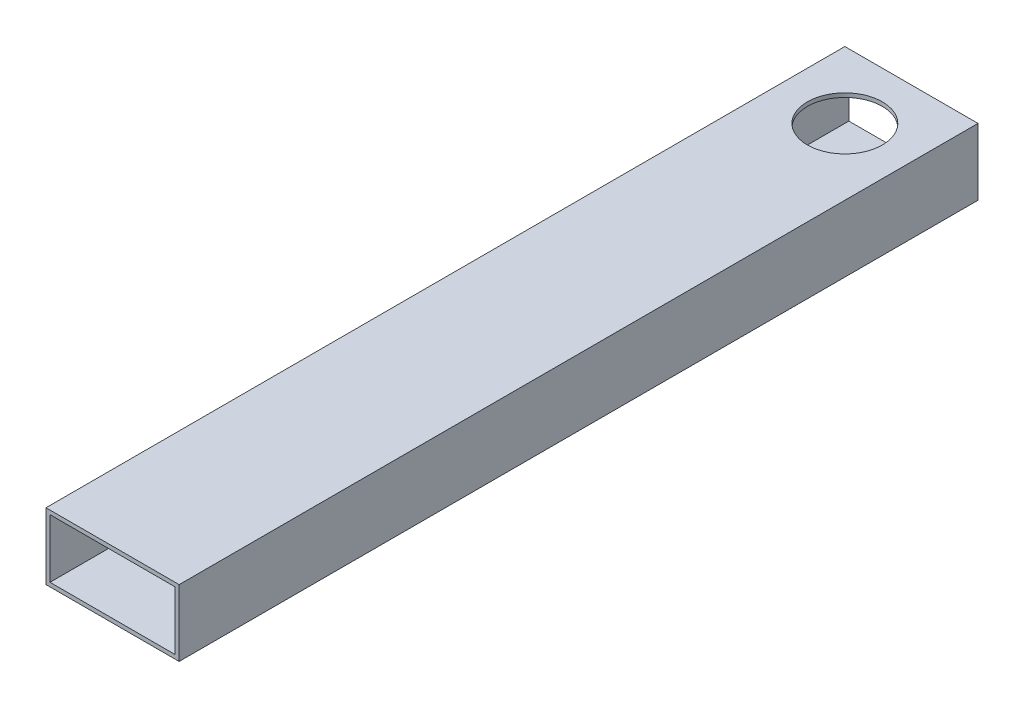
ISO-10303-21;
HEADER;
FILE_DESCRIPTION(('STEP AP214'),'2;1');
FILE_NAME('part.step','',(''),(''),'','','');
FILE_SCHEMA(('AUTOMOTIVE_DESIGN { 1 0 10303 214 1 1 1 1 }'));
ENDSEC;
DATA;
#1=APPLICATION_CONTEXT('core data for automotive mechanical design processes');
#2=APPLICATION_PROTOCOL_DEFINITION('international standard','automotive_design',2000,#1);
#3=PRODUCT_CONTEXT('',#1,'mechanical');
#4=PRODUCT('Part','Part','',(#3));
#5=PRODUCT_RELATED_PRODUCT_CATEGORY('part','',(#4));
#6=PRODUCT_DEFINITION_FORMATION('','',#4);
#7=PRODUCT_DEFINITION_CONTEXT('part definition',#1,'design');
#8=PRODUCT_DEFINITION('design','',#6,#7);
#9=PRODUCT_DEFINITION_SHAPE('','',#8);
#10=(LENGTH_UNIT() NAMED_UNIT(*) SI_UNIT(.MILLI.,.METRE.));
#11=(NAMED_UNIT(*) PLANE_ANGLE_UNIT() SI_UNIT($,.RADIAN.));
#12=(NAMED_UNIT(*) SI_UNIT($,.STERADIAN.) SOLID_ANGLE_UNIT());
#13=UNCERTAINTY_MEASURE_WITH_UNIT(LENGTH_MEASURE(1.E-05),#10,'distance_accuracy_value','');
#14=(GEOMETRIC_REPRESENTATION_CONTEXT(3) GLOBAL_UNCERTAINTY_ASSIGNED_CONTEXT((#13)) GLOBAL_UNIT_ASSIGNED_CONTEXT((#10,
#11,#12)) REPRESENTATION_CONTEXT('',''));
#15=CARTESIAN_POINT('',(0.,0.,0.));
#16=DIRECTION('',(0.,0.,1.));
#17=DIRECTION('',(1.,0.,0.));
#18=AXIS2_PLACEMENT_3D('',#15,#16,#17);
#19=CARTESIAN_POINT('',(0.,0.,304.8));
#20=DIRECTION('',(0.,0.,1.));
#21=DIRECTION('',(1.,0.,0.));
#22=AXIS2_PLACEMENT_3D('',#19,#20,#21);
#23=PLANE('',#22);
#24=DIRECTION('',(0.,1.,0.));
#25=VECTOR('',#24,1.);
#26=CARTESIAN_POINT('',(0.,0.,304.8));
#27=LINE('',#26,#25);
#28=CARTESIAN_POINT('',(0.,-25.4,304.8));
#29=VERTEX_POINT('',#28);
#30=CARTESIAN_POINT('',(0.,0.,304.8));
#31=VERTEX_POINT('',#30);
#32=EDGE_CURVE('E180',#29,#31,#27,.T.);
#33=ORIENTED_EDGE('',*,*,#32,.T.);
#34=DIRECTION('',(-1.,0.,0.));
#35=VECTOR('',#34,1.);
#36=CARTESIAN_POINT('',(0.,0.,304.8));
#37=LINE('',#36,#35);
#38=CARTESIAN_POINT('',(-50.8,0.,304.8));
#39=VERTEX_POINT('',#38);
#40=EDGE_CURVE('E184',#31,#39,#37,.T.);
#41=ORIENTED_EDGE('',*,*,#40,.T.);
#42=DIRECTION('',(0.,-1.,0.));
#43=VECTOR('',#42,1.);
#44=CARTESIAN_POINT('',(-50.8,0.,304.8));
#45=LINE('',#44,#43);
#46=CARTESIAN_POINT('',(-50.8,-25.4,304.8));
#47=VERTEX_POINT('',#46);
#48=EDGE_CURVE('E188',#39,#47,#45,.T.);
#49=ORIENTED_EDGE('',*,*,#48,.T.);
#50=DIRECTION('',(1.,0.,0.));
#51=VECTOR('',#50,1.);
#52=CARTESIAN_POINT('',(0.,-25.4,304.8));
#53=LINE('',#52,#51);
#54=EDGE_CURVE('E191',#47,#29,#53,.T.);
#55=ORIENTED_EDGE('',*,*,#54,.T.);
#56=EDGE_LOOP('',(#33,#41,#49,#55));
#57=FACE_BOUND('',#56,.T.);
#58=DIRECTION('',(-1.,0.,0.));
#59=VECTOR('',#58,1.);
#60=CARTESIAN_POINT('',(0.,-1.524,304.8));
#61=LINE('',#60,#59);
#62=CARTESIAN_POINT('',(-1.524,-1.524,304.8));
#63=VERTEX_POINT('',#62);
#64=CARTESIAN_POINT('',(-49.276,-1.524,304.8));
#65=VERTEX_POINT('',#64);
#66=EDGE_CURVE('E139',#63,#65,#61,.T.);
#67=ORIENTED_EDGE('',*,*,#66,.F.);
#68=DIRECTION('',(0.,1.,0.));
#69=VECTOR('',#68,1.);
#70=CARTESIAN_POINT('',(-1.524,0.,304.8));
#71=LINE('',#70,#69);
#72=CARTESIAN_POINT('',(-1.524,-23.876,304.8));
#73=VERTEX_POINT('',#72);
#74=EDGE_CURVE('E130',#73,#63,#71,.T.);
#75=ORIENTED_EDGE('',*,*,#74,.F.);
#76=DIRECTION('',(1.,0.,0.));
#77=VECTOR('',#76,1.);
#78=CARTESIAN_POINT('',(0.,-23.876,304.8));
#79=LINE('',#78,#77);
#80=CARTESIAN_POINT('',(-49.276,-23.876,304.8));
#81=VERTEX_POINT('',#80);
#82=EDGE_CURVE('E156',#81,#73,#79,.T.);
#83=ORIENTED_EDGE('',*,*,#82,.F.);
#84=DIRECTION('',(0.,-1.,0.));
#85=VECTOR('',#84,1.);
#86=CARTESIAN_POINT('',(-49.276,0.,304.8));
#87=LINE('',#86,#85);
#88=EDGE_CURVE('E152',#65,#81,#87,.T.);
#89=ORIENTED_EDGE('',*,*,#88,.F.);
#90=EDGE_LOOP('',(#67,#75,#83,#89));
#91=FACE_BOUND('',#90,.T.);
#92=ADVANCED_FACE('F63',(#57,#91),#23,.T.);
#93=CARTESIAN_POINT('',(0.,0.,0.));
#94=DIRECTION('',(0.,0.,1.));
#95=DIRECTION('',(1.,0.,0.));
#96=AXIS2_PLACEMENT_3D('',#93,#94,#95);
#97=PLANE('',#96);
#98=DIRECTION('',(0.,1.,0.));
#99=VECTOR('',#98,1.);
#100=CARTESIAN_POINT('',(0.,0.,0.));
#101=LINE('',#100,#99);
#102=CARTESIAN_POINT('',(0.,-25.4,0.));
#103=VERTEX_POINT('',#102);
#104=CARTESIAN_POINT('',(0.,0.,0.));
#105=VERTEX_POINT('',#104);
#106=EDGE_CURVE('E148',#103,#105,#101,.T.);
#107=ORIENTED_EDGE('',*,*,#106,.F.);
#108=DIRECTION('',(1.,0.,0.));
#109=VECTOR('',#108,1.);
#110=CARTESIAN_POINT('',(0.,-25.4,0.));
#111=LINE('',#110,#109);
#112=CARTESIAN_POINT('',(-50.8,-25.4,0.));
#113=VERTEX_POINT('',#112);
#114=EDGE_CURVE('E185',#113,#103,#111,.T.);
#115=ORIENTED_EDGE('',*,*,#114,.F.);
#116=DIRECTION('',(0.,-1.,0.));
#117=VECTOR('',#116,1.);
#118=CARTESIAN_POINT('',(-50.8,0.,0.));
#119=LINE('',#118,#117);
#120=CARTESIAN_POINT('',(-50.8,0.,0.));
#121=VERTEX_POINT('',#120);
#122=EDGE_CURVE('E201',#121,#113,#119,.T.);
#123=ORIENTED_EDGE('',*,*,#122,.F.);
#124=DIRECTION('',(-1.,0.,0.));
#125=VECTOR('',#124,1.);
#126=CARTESIAN_POINT('',(0.,0.,0.));
#127=LINE('',#126,#125);
#128=EDGE_CURVE('E198',#105,#121,#127,.T.);
#129=ORIENTED_EDGE('',*,*,#128,.F.);
#130=EDGE_LOOP('',(#107,#115,#123,#129));
#131=FACE_BOUND('',#130,.T.);
#132=DIRECTION('',(0.,1.,0.));
#133=VECTOR('',#132,1.);
#134=CARTESIAN_POINT('',(-1.524,0.,0.));
#135=LINE('',#134,#133);
#136=CARTESIAN_POINT('',(-1.524,-23.876,0.));
#137=VERTEX_POINT('',#136);
#138=CARTESIAN_POINT('',(-1.524,-1.524,0.));
#139=VERTEX_POINT('',#138);
#140=EDGE_CURVE('E88',#137,#139,#135,.T.);
#141=ORIENTED_EDGE('',*,*,#140,.T.);
#142=DIRECTION('',(-1.,0.,0.));
#143=VECTOR('',#142,1.);
#144=CARTESIAN_POINT('',(0.,-1.524,0.));
#145=LINE('',#144,#143);
#146=CARTESIAN_POINT('',(-49.276,-1.524,0.));
#147=VERTEX_POINT('',#146);
#148=EDGE_CURVE('E146',#139,#147,#145,.T.);
#149=ORIENTED_EDGE('',*,*,#148,.T.);
#150=DIRECTION('',(0.,-1.,0.));
#151=VECTOR('',#150,1.);
#152=CARTESIAN_POINT('',(-49.276,0.,0.));
#153=LINE('',#152,#151);
#154=CARTESIAN_POINT('',(-49.276,-23.876,0.));
#155=VERTEX_POINT('',#154);
#156=EDGE_CURVE('E167',#147,#155,#153,.T.);
#157=ORIENTED_EDGE('',*,*,#156,.T.);
#158=DIRECTION('',(1.,0.,0.));
#159=VECTOR('',#158,1.);
#160=CARTESIAN_POINT('',(0.,-23.876,0.));
#161=LINE('',#160,#159);
#162=EDGE_CURVE('E140',#155,#137,#161,.T.);
#163=ORIENTED_EDGE('',*,*,#162,.T.);
#164=EDGE_LOOP('',(#141,#149,#157,#163));
#165=FACE_BOUND('',#164,.T.);
#166=ADVANCED_FACE('F225',(#131,#165),#97,.F.);
#167=CARTESIAN_POINT('',(0.,0.,304.8));
#168=DIRECTION('',(-1.,0.,0.));
#169=DIRECTION('',(0.,-1.,0.));
#170=AXIS2_PLACEMENT_3D('',#167,#168,#169);
#171=PLANE('',#170);
#172=ORIENTED_EDGE('',*,*,#106,.T.);
#173=DIRECTION('',(0.,0.,-1.));
#174=VECTOR('',#173,1.);
#175=CARTESIAN_POINT('',(0.,0.,304.8));
#176=LINE('',#175,#174);
#177=EDGE_CURVE('E12',#31,#105,#176,.T.);
#178=ORIENTED_EDGE('',*,*,#177,.F.);
#179=ORIENTED_EDGE('',*,*,#32,.F.);
#180=DIRECTION('',(0.,0.,-1.));
#181=VECTOR('',#180,1.);
#182=CARTESIAN_POINT('',(0.,-25.4,304.8));
#183=LINE('',#182,#181);
#184=EDGE_CURVE('E194',#29,#103,#183,.T.);
#185=ORIENTED_EDGE('',*,*,#184,.T.);
#186=EDGE_LOOP('',(#172,#178,#179,#185));
#187=FACE_BOUND('',#186,.T.);
#188=ADVANCED_FACE('F65',(#187),#171,.F.);
#189=CARTESIAN_POINT('',(0.,0.,304.8));
#190=DIRECTION('',(0.,-1.,0.));
#191=DIRECTION('',(0.,0.,-1.));
#192=AXIS2_PLACEMENT_3D('',#189,#190,#191);
#193=PLANE('',#192);
#194=CARTESIAN_POINT('',(-25.4,0.,25.4));
#195=DIRECTION('',(0.,1.,0.));
#196=DIRECTION('',(0.,0.,1.));
#197=AXIS2_PLACEMENT_3D('',#194,#195,#196);
#198=CIRCLE('',#197,14.2875);
#199=CARTESIAN_POINT('',(-25.4,0.,39.6875));
#200=VERTEX_POINT('',#199);
#201=EDGE_CURVE('E263',#200,#200,#198,.T.);
#202=ORIENTED_EDGE('',*,*,#201,.F.);
#203=EDGE_LOOP('',(#202));
#204=FACE_BOUND('',#203,.T.);
#205=ORIENTED_EDGE('',*,*,#128,.T.);
#206=DIRECTION('',(0.,0.,-1.));
#207=VECTOR('',#206,1.);
#208=CARTESIAN_POINT('',(-50.8,0.,304.8));
#209=LINE('',#208,#207);
#210=EDGE_CURVE('E73',#39,#121,#209,.T.);
#211=ORIENTED_EDGE('',*,*,#210,.F.);
#212=ORIENTED_EDGE('',*,*,#40,.F.);
#213=ORIENTED_EDGE('',*,*,#177,.T.);
#214=EDGE_LOOP('',(#205,#211,#212,#213));
#215=FACE_BOUND('',#214,.T.);
#216=ADVANCED_FACE('F235',(#204,#215),#193,.F.);
#217=CARTESIAN_POINT('',(-50.8,0.,304.8));
#218=DIRECTION('',(1.,0.,0.));
#219=DIRECTION('',(0.,0.,-1.));
#220=AXIS2_PLACEMENT_3D('',#217,#218,#219);
#221=PLANE('',#220);
#222=ORIENTED_EDGE('',*,*,#122,.T.);
#223=DIRECTION('',(0.,0.,-1.));
#224=VECTOR('',#223,1.);
#225=CARTESIAN_POINT('',(-50.8,-25.4,304.8));
#226=LINE('',#225,#224);
#227=EDGE_CURVE('E209',#47,#113,#226,.T.);
#228=ORIENTED_EDGE('',*,*,#227,.F.);
#229=ORIENTED_EDGE('',*,*,#48,.F.);
#230=ORIENTED_EDGE('',*,*,#210,.T.);
#231=EDGE_LOOP('',(#222,#228,#229,#230));
#232=FACE_BOUND('',#231,.T.);
#233=ADVANCED_FACE('F219',(#232),#221,.F.);
#234=CARTESIAN_POINT('',(0.,-25.4,304.8));
#235=DIRECTION('',(0.,1.,0.));
#236=DIRECTION('',(-1.,0.,0.));
#237=AXIS2_PLACEMENT_3D('',#234,#235,#236);
#238=PLANE('',#237);
#239=CARTESIAN_POINT('',(-25.4,-25.4,25.4));
#240=DIRECTION('',(0.,1.,0.));
#241=DIRECTION('',(0.,0.,1.));
#242=AXIS2_PLACEMENT_3D('',#239,#240,#241);
#243=CIRCLE('',#242,14.2875);
#244=CARTESIAN_POINT('',(-25.4,-25.4,39.6875));
#245=VERTEX_POINT('',#244);
#246=EDGE_CURVE('E260',#245,#245,#243,.T.);
#247=ORIENTED_EDGE('',*,*,#246,.T.);
#248=EDGE_LOOP('',(#247));
#249=FACE_BOUND('',#248,.T.);
#250=ORIENTED_EDGE('',*,*,#114,.T.);
#251=ORIENTED_EDGE('',*,*,#184,.F.);
#252=ORIENTED_EDGE('',*,*,#54,.F.);
#253=ORIENTED_EDGE('',*,*,#227,.T.);
#254=EDGE_LOOP('',(#250,#251,#252,#253));
#255=FACE_BOUND('',#254,.T.);
#256=ADVANCED_FACE('F229',(#249,#255),#238,.F.);
#257=CARTESIAN_POINT('',(-1.524,0.,304.8));
#258=DIRECTION('',(-1.,0.,0.));
#259=DIRECTION('',(0.,-1.,0.));
#260=AXIS2_PLACEMENT_3D('',#257,#258,#259);
#261=PLANE('',#260);
#262=ORIENTED_EDGE('',*,*,#140,.F.);
#263=DIRECTION('',(0.,0.,-1.));
#264=VECTOR('',#263,1.);
#265=CARTESIAN_POINT('',(-1.524,-23.876,304.8));
#266=LINE('',#265,#264);
#267=EDGE_CURVE('E134',#73,#137,#266,.T.);
#268=ORIENTED_EDGE('',*,*,#267,.F.);
#269=ORIENTED_EDGE('',*,*,#74,.T.);
#270=DIRECTION('',(0.,0.,-1.));
#271=VECTOR('',#270,1.);
#272=CARTESIAN_POINT('',(-1.524,-1.524,304.8));
#273=LINE('',#272,#271);
#274=EDGE_CURVE('E133',#63,#139,#273,.T.);
#275=ORIENTED_EDGE('',*,*,#274,.T.);
#276=EDGE_LOOP('',(#262,#268,#269,#275));
#277=FACE_BOUND('',#276,.T.);
#278=ADVANCED_FACE('F132',(#277),#261,.T.);
#279=CARTESIAN_POINT('',(0.,-1.524,304.8));
#280=DIRECTION('',(0.,-1.,0.));
#281=DIRECTION('',(0.,0.,-1.));
#282=AXIS2_PLACEMENT_3D('',#279,#280,#281);
#283=PLANE('',#282);
#284=CARTESIAN_POINT('',(-25.4,-1.524,25.4));
#285=DIRECTION('',(0.,-1.,0.));
#286=DIRECTION('',(0.,0.,-1.));
#287=AXIS2_PLACEMENT_3D('',#284,#285,#286);
#288=CIRCLE('',#287,14.2875);
#289=CARTESIAN_POINT('',(-25.4,-1.524,11.1125));
#290=VERTEX_POINT('',#289);
#291=EDGE_CURVE('E164',#290,#290,#288,.T.);
#292=ORIENTED_EDGE('',*,*,#291,.F.);
#293=EDGE_LOOP('',(#292));
#294=FACE_BOUND('',#293,.T.);
#295=ORIENTED_EDGE('',*,*,#148,.F.);
#296=ORIENTED_EDGE('',*,*,#274,.F.);
#297=ORIENTED_EDGE('',*,*,#66,.T.);
#298=DIRECTION('',(0.,0.,-1.));
#299=VECTOR('',#298,1.);
#300=CARTESIAN_POINT('',(-49.276,-1.524,304.8));
#301=LINE('',#300,#299);
#302=EDGE_CURVE('E149',#65,#147,#301,.T.);
#303=ORIENTED_EDGE('',*,*,#302,.T.);
#304=EDGE_LOOP('',(#295,#296,#297,#303));
#305=FACE_BOUND('',#304,.T.);
#306=ADVANCED_FACE('F143',(#294,#305),#283,.T.);
#307=CARTESIAN_POINT('',(-49.276,0.,304.8));
#308=DIRECTION('',(1.,0.,0.));
#309=DIRECTION('',(0.,0.,-1.));
#310=AXIS2_PLACEMENT_3D('',#307,#308,#309);
#311=PLANE('',#310);
#312=ORIENTED_EDGE('',*,*,#156,.F.);
#313=ORIENTED_EDGE('',*,*,#302,.F.);
#314=ORIENTED_EDGE('',*,*,#88,.T.);
#315=DIRECTION('',(0.,0.,-1.));
#316=VECTOR('',#315,1.);
#317=CARTESIAN_POINT('',(-49.276,-23.876,304.8));
#318=LINE('',#317,#316);
#319=EDGE_CURVE('E80',#81,#155,#318,.T.);
#320=ORIENTED_EDGE('',*,*,#319,.T.);
#321=EDGE_LOOP('',(#312,#313,#314,#320));
#322=FACE_BOUND('',#321,.T.);
#323=ADVANCED_FACE('F278',(#322),#311,.T.);
#324=CARTESIAN_POINT('',(0.,-23.876,304.8));
#325=DIRECTION('',(0.,1.,0.));
#326=DIRECTION('',(-1.,0.,0.));
#327=AXIS2_PLACEMENT_3D('',#324,#325,#326);
#328=PLANE('',#327);
#329=CARTESIAN_POINT('',(-25.4,-23.876,25.4));
#330=DIRECTION('',(0.,1.,0.));
#331=DIRECTION('',(-1.,0.,0.));
#332=AXIS2_PLACEMENT_3D('',#329,#330,#331);
#333=CIRCLE('',#332,14.2875);
#334=CARTESIAN_POINT('',(-39.6875,-23.876,25.4));
#335=VERTEX_POINT('',#334);
#336=EDGE_CURVE('E67',#335,#335,#333,.T.);
#337=ORIENTED_EDGE('',*,*,#336,.F.);
#338=EDGE_LOOP('',(#337));
#339=FACE_BOUND('',#338,.T.);
#340=ORIENTED_EDGE('',*,*,#162,.F.);
#341=ORIENTED_EDGE('',*,*,#319,.F.);
#342=ORIENTED_EDGE('',*,*,#82,.T.);
#343=ORIENTED_EDGE('',*,*,#267,.T.);
#344=EDGE_LOOP('',(#340,#341,#342,#343));
#345=FACE_BOUND('',#344,.T.);
#346=ADVANCED_FACE('F282',(#339,#345),#328,.T.);
#347=CARTESIAN_POINT('',(-25.4,-25.4,25.4));
#348=DIRECTION('',(0.,1.,0.));
#349=DIRECTION('',(0.,0.,1.));
#350=AXIS2_PLACEMENT_3D('',#347,#348,#349);
#351=CYLINDRICAL_SURFACE('',#350,14.2875);
#352=ORIENTED_EDGE('',*,*,#336,.T.);
#353=EDGE_LOOP('',(#352));
#354=FACE_BOUND('',#353,.T.);
#355=ORIENTED_EDGE('',*,*,#246,.F.);
#356=EDGE_LOOP('',(#355));
#357=FACE_BOUND('',#356,.T.);
#358=ADVANCED_FACE('F288',(#354,#357),#351,.F.);
#359=ORIENTED_EDGE('',*,*,#291,.T.);
#360=EDGE_LOOP('',(#359));
#361=FACE_BOUND('',#360,.T.);
#362=ORIENTED_EDGE('',*,*,#201,.T.);
#363=EDGE_LOOP('',(#362));
#364=FACE_BOUND('',#363,.T.);
#365=ADVANCED_FACE('F274',(#361,#364),#351,.F.);
#366=CLOSED_SHELL('',(#92,#166,#188,#216,#233,#256,#278,#306,#323,#346,#358,#365));
#367=MANIFOLD_SOLID_BREP('B2',#366);
#368=ADVANCED_BREP_SHAPE_REPRESENTATION('',(#18,#367),#14);
#369=SHAPE_DEFINITION_REPRESENTATION(#9,#368);
ENDSEC;
END-ISO-10303-21;
